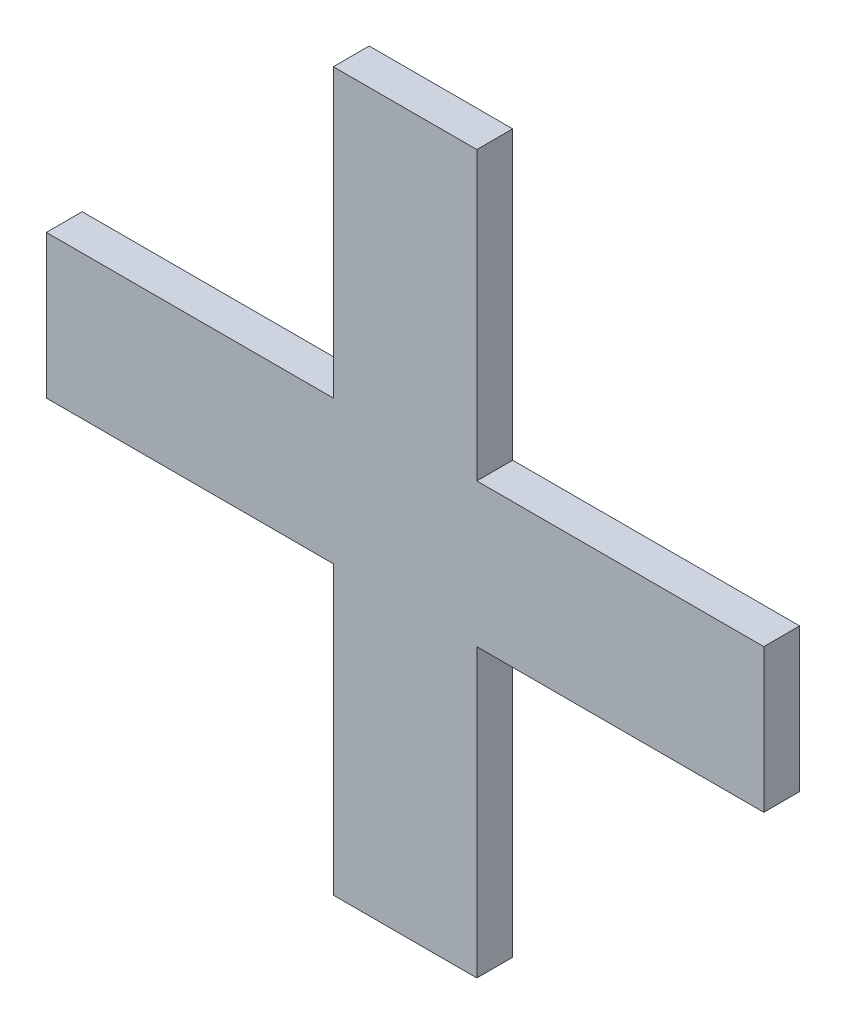
ISO-10303-21;
HEADER;
FILE_DESCRIPTION(('STEP AP214'),'2;1');
FILE_NAME('part.step','',(''),(''),'','','');
FILE_SCHEMA(('AUTOMOTIVE_DESIGN { 1 0 10303 214 1 1 1 1 }'));
ENDSEC;
DATA;
#1=APPLICATION_CONTEXT('core data for automotive mechanical design processes');
#2=APPLICATION_PROTOCOL_DEFINITION('international standard','automotive_design',2000,#1);
#3=PRODUCT_CONTEXT('',#1,'mechanical');
#4=PRODUCT('Part','Part','',(#3));
#5=PRODUCT_RELATED_PRODUCT_CATEGORY('part','',(#4));
#6=PRODUCT_DEFINITION_FORMATION('','',#4);
#7=PRODUCT_DEFINITION_CONTEXT('part definition',#1,'design');
#8=PRODUCT_DEFINITION('design','',#6,#7);
#9=PRODUCT_DEFINITION_SHAPE('','',#8);
#10=(LENGTH_UNIT() NAMED_UNIT(*) SI_UNIT(.MILLI.,.METRE.));
#11=(NAMED_UNIT(*) PLANE_ANGLE_UNIT() SI_UNIT($,.RADIAN.));
#12=(NAMED_UNIT(*) SI_UNIT($,.STERADIAN.) SOLID_ANGLE_UNIT());
#13=UNCERTAINTY_MEASURE_WITH_UNIT(LENGTH_MEASURE(1.E-05),#10,'distance_accuracy_value','');
#14=(GEOMETRIC_REPRESENTATION_CONTEXT(3) GLOBAL_UNCERTAINTY_ASSIGNED_CONTEXT((#13)) GLOBAL_UNIT_ASSIGNED_CONTEXT((#10,
#11,#12)) REPRESENTATION_CONTEXT('',''));
#15=CARTESIAN_POINT('',(0.,0.,0.));
#16=DIRECTION('',(0.,0.,1.));
#17=DIRECTION('',(1.,0.,0.));
#18=AXIS2_PLACEMENT_3D('',#15,#16,#17);
#19=CARTESIAN_POINT('',(-6.35,8.17803030303031,3.175));
#20=DIRECTION('',(1.,0.,0.));
#21=DIRECTION('',(0.,1.,0.));
#22=AXIS2_PLACEMENT_3D('',#19,#20,#21);
#23=PLANE('',#22);
#24=DIRECTION('',(0.,-1.,0.));
#25=VECTOR('',#24,1.);
#26=CARTESIAN_POINT('',(-6.35,8.17803030303031,0.));
#27=LINE('',#26,#25);
#28=CARTESIAN_POINT('',(-6.35,33.5780303030303,0.));
#29=VERTEX_POINT('',#28);
#30=CARTESIAN_POINT('',(-6.35,8.17803030303031,0.));
#31=VERTEX_POINT('',#30);
#32=EDGE_CURVE('E153',#29,#31,#27,.T.);
#33=ORIENTED_EDGE('',*,*,#32,.T.);
#34=DIRECTION('',(0.,0.,-1.));
#35=VECTOR('',#34,1.);
#36=CARTESIAN_POINT('',(-6.35,8.17803030303031,3.175));
#37=LINE('',#36,#35);
#38=CARTESIAN_POINT('',(-6.35,8.17803030303031,3.175));
#39=VERTEX_POINT('',#38);
#40=EDGE_CURVE('E11',#39,#31,#37,.T.);
#41=ORIENTED_EDGE('',*,*,#40,.F.);
#42=DIRECTION('',(0.,-1.,0.));
#43=VECTOR('',#42,1.);
#44=CARTESIAN_POINT('',(-6.35,8.17803030303031,3.175));
#45=LINE('',#44,#43);
#46=CARTESIAN_POINT('',(-6.35,33.5780303030303,3.175));
#47=VERTEX_POINT('',#46);
#48=EDGE_CURVE('E175',#47,#39,#45,.T.);
#49=ORIENTED_EDGE('',*,*,#48,.F.);
#50=DIRECTION('',(0.,0.,-1.));
#51=VECTOR('',#50,1.);
#52=CARTESIAN_POINT('',(-6.35,33.5780303030303,3.175));
#53=LINE('',#52,#51);
#54=EDGE_CURVE('E149',#47,#29,#53,.T.);
#55=ORIENTED_EDGE('',*,*,#54,.T.);
#56=EDGE_LOOP('',(#33,#41,#49,#55));
#57=FACE_BOUND('',#56,.T.);
#58=ADVANCED_FACE('F33',(#57),#23,.F.);
#59=CARTESIAN_POINT('',(-31.75,8.17803030303031,3.175));
#60=DIRECTION('',(0.,-1.,0.));
#61=DIRECTION('',(1.,0.,0.));
#62=AXIS2_PLACEMENT_3D('',#59,#60,#61);
#63=PLANE('',#62);
#64=DIRECTION('',(-1.,0.,0.));
#65=VECTOR('',#64,1.);
#66=CARTESIAN_POINT('',(-31.75,8.17803030303031,0.));
#67=LINE('',#66,#65);
#68=CARTESIAN_POINT('',(-31.75,8.17803030303031,0.));
#69=VERTEX_POINT('',#68);
#70=EDGE_CURVE('E156',#31,#69,#67,.T.);
#71=ORIENTED_EDGE('',*,*,#70,.T.);
#72=DIRECTION('',(0.,0.,-1.));
#73=VECTOR('',#72,1.);
#74=CARTESIAN_POINT('',(-31.75,8.17803030303031,3.175));
#75=LINE('',#74,#73);
#76=CARTESIAN_POINT('',(-31.75,8.17803030303031,3.175));
#77=VERTEX_POINT('',#76);
#78=EDGE_CURVE('E41',#77,#69,#75,.T.);
#79=ORIENTED_EDGE('',*,*,#78,.F.);
#80=DIRECTION('',(-1.,0.,0.));
#81=VECTOR('',#80,1.);
#82=CARTESIAN_POINT('',(-31.75,8.17803030303031,3.175));
#83=LINE('',#82,#81);
#84=EDGE_CURVE('E104',#39,#77,#83,.T.);
#85=ORIENTED_EDGE('',*,*,#84,.F.);
#86=ORIENTED_EDGE('',*,*,#40,.T.);
#87=EDGE_LOOP('',(#71,#79,#85,#86));
#88=FACE_BOUND('',#87,.T.);
#89=ADVANCED_FACE('F253',(#88),#63,.F.);
#90=CARTESIAN_POINT('',(-31.75,-4.52196969696969,3.175));
#91=DIRECTION('',(1.,0.,0.));
#92=DIRECTION('',(0.,0.,-1.));
#93=AXIS2_PLACEMENT_3D('',#90,#91,#92);
#94=PLANE('',#93);
#95=DIRECTION('',(0.,-1.,0.));
#96=VECTOR('',#95,1.);
#97=CARTESIAN_POINT('',(-31.75,-4.52196969696969,0.));
#98=LINE('',#97,#96);
#99=CARTESIAN_POINT('',(-31.75,-4.52196969696969,0.));
#100=VERTEX_POINT('',#99);
#101=EDGE_CURVE('E158',#69,#100,#98,.T.);
#102=ORIENTED_EDGE('',*,*,#101,.T.);
#103=DIRECTION('',(0.,0.,-1.));
#104=VECTOR('',#103,1.);
#105=CARTESIAN_POINT('',(-31.75,-4.52196969696969,3.175));
#106=LINE('',#105,#104);
#107=CARTESIAN_POINT('',(-31.75,-4.52196969696969,3.175));
#108=VERTEX_POINT('',#107);
#109=EDGE_CURVE('E194',#108,#100,#106,.T.);
#110=ORIENTED_EDGE('',*,*,#109,.F.);
#111=DIRECTION('',(0.,-1.,0.));
#112=VECTOR('',#111,1.);
#113=CARTESIAN_POINT('',(-31.75,-4.52196969696969,3.175));
#114=LINE('',#113,#112);
#115=EDGE_CURVE('E202',#77,#108,#114,.T.);
#116=ORIENTED_EDGE('',*,*,#115,.F.);
#117=ORIENTED_EDGE('',*,*,#78,.T.);
#118=EDGE_LOOP('',(#102,#110,#116,#117));
#119=FACE_BOUND('',#118,.T.);
#120=ADVANCED_FACE('F200',(#119),#94,.F.);
#121=CARTESIAN_POINT('',(-6.35,-4.52196969696969,3.175));
#122=DIRECTION('',(0.,1.,0.));
#123=DIRECTION('',(-1.,0.,0.));
#124=AXIS2_PLACEMENT_3D('',#121,#122,#123);
#125=PLANE('',#124);
#126=DIRECTION('',(1.,0.,0.));
#127=VECTOR('',#126,1.);
#128=CARTESIAN_POINT('',(-6.35,-4.52196969696969,0.));
#129=LINE('',#128,#127);
#130=CARTESIAN_POINT('',(-6.35,-4.52196969696969,0.));
#131=VERTEX_POINT('',#130);
#132=EDGE_CURVE('E160',#100,#131,#129,.T.);
#133=ORIENTED_EDGE('',*,*,#132,.T.);
#134=DIRECTION('',(0.,0.,-1.));
#135=VECTOR('',#134,1.);
#136=CARTESIAN_POINT('',(-6.35,-4.52196969696969,3.175));
#137=LINE('',#136,#135);
#138=CARTESIAN_POINT('',(-6.35,-4.52196969696969,3.175));
#139=VERTEX_POINT('',#138);
#140=EDGE_CURVE('E191',#139,#131,#137,.T.);
#141=ORIENTED_EDGE('',*,*,#140,.F.);
#142=DIRECTION('',(1.,0.,0.));
#143=VECTOR('',#142,1.);
#144=CARTESIAN_POINT('',(-6.35,-4.52196969696969,3.175));
#145=LINE('',#144,#143);
#146=EDGE_CURVE('E220',#108,#139,#145,.T.);
#147=ORIENTED_EDGE('',*,*,#146,.F.);
#148=ORIENTED_EDGE('',*,*,#109,.T.);
#149=EDGE_LOOP('',(#133,#141,#147,#148));
#150=FACE_BOUND('',#149,.T.);
#151=ADVANCED_FACE('F211',(#150),#125,.F.);
#152=CARTESIAN_POINT('',(-6.35,-29.9219696969697,3.175));
#153=DIRECTION('',(1.,0.,0.));
#154=DIRECTION('',(0.,1.,0.));
#155=AXIS2_PLACEMENT_3D('',#152,#153,#154);
#156=PLANE('',#155);
#157=DIRECTION('',(0.,-1.,0.));
#158=VECTOR('',#157,1.);
#159=CARTESIAN_POINT('',(-6.35,-29.9219696969697,0.));
#160=LINE('',#159,#158);
#161=CARTESIAN_POINT('',(-6.35,-29.9219696969697,0.));
#162=VERTEX_POINT('',#161);
#163=EDGE_CURVE('E162',#131,#162,#160,.T.);
#164=ORIENTED_EDGE('',*,*,#163,.T.);
#165=DIRECTION('',(0.,0.,-1.));
#166=VECTOR('',#165,1.);
#167=CARTESIAN_POINT('',(-6.35,-29.9219696969697,3.175));
#168=LINE('',#167,#166);
#169=CARTESIAN_POINT('',(-6.35,-29.9219696969697,3.175));
#170=VERTEX_POINT('',#169);
#171=EDGE_CURVE('E188',#170,#162,#168,.T.);
#172=ORIENTED_EDGE('',*,*,#171,.F.);
#173=DIRECTION('',(0.,-1.,0.));
#174=VECTOR('',#173,1.);
#175=CARTESIAN_POINT('',(-6.35,-29.9219696969697,3.175));
#176=LINE('',#175,#174);
#177=EDGE_CURVE('E217',#139,#170,#176,.T.);
#178=ORIENTED_EDGE('',*,*,#177,.F.);
#179=ORIENTED_EDGE('',*,*,#140,.T.);
#180=EDGE_LOOP('',(#164,#172,#178,#179));
#181=FACE_BOUND('',#180,.T.);
#182=ADVANCED_FACE('F215',(#181),#156,.F.);
#183=CARTESIAN_POINT('',(6.35,-29.9219696969697,3.175));
#184=DIRECTION('',(0.,1.,0.));
#185=DIRECTION('',(0.,0.,1.));
#186=AXIS2_PLACEMENT_3D('',#183,#184,#185);
#187=PLANE('',#186);
#188=DIRECTION('',(1.,0.,0.));
#189=VECTOR('',#188,1.);
#190=CARTESIAN_POINT('',(6.35,-29.9219696969697,0.));
#191=LINE('',#190,#189);
#192=CARTESIAN_POINT('',(6.35,-29.9219696969697,0.));
#193=VERTEX_POINT('',#192);
#194=EDGE_CURVE('E164',#162,#193,#191,.T.);
#195=ORIENTED_EDGE('',*,*,#194,.T.);
#196=DIRECTION('',(0.,0.,-1.));
#197=VECTOR('',#196,1.);
#198=CARTESIAN_POINT('',(6.35,-29.9219696969697,3.175));
#199=LINE('',#198,#197);
#200=CARTESIAN_POINT('',(6.35,-29.9219696969697,3.175));
#201=VERTEX_POINT('',#200);
#202=EDGE_CURVE('E185',#201,#193,#199,.T.);
#203=ORIENTED_EDGE('',*,*,#202,.F.);
#204=DIRECTION('',(1.,0.,0.));
#205=VECTOR('',#204,1.);
#206=CARTESIAN_POINT('',(6.35,-29.9219696969697,3.175));
#207=LINE('',#206,#205);
#208=EDGE_CURVE('E219',#170,#201,#207,.T.);
#209=ORIENTED_EDGE('',*,*,#208,.F.);
#210=ORIENTED_EDGE('',*,*,#171,.T.);
#211=EDGE_LOOP('',(#195,#203,#209,#210));
#212=FACE_BOUND('',#211,.T.);
#213=ADVANCED_FACE('F266',(#212),#187,.F.);
#214=CARTESIAN_POINT('',(6.35,-4.5219696969697,3.175));
#215=DIRECTION('',(-1.,0.,0.));
#216=DIRECTION('',(0.,-1.,0.));
#217=AXIS2_PLACEMENT_3D('',#214,#215,#216);
#218=PLANE('',#217);
#219=DIRECTION('',(0.,1.,0.));
#220=VECTOR('',#219,1.);
#221=CARTESIAN_POINT('',(6.35,-4.5219696969697,0.));
#222=LINE('',#221,#220);
#223=CARTESIAN_POINT('',(6.35,-4.5219696969697,0.));
#224=VERTEX_POINT('',#223);
#225=EDGE_CURVE('E166',#193,#224,#222,.T.);
#226=ORIENTED_EDGE('',*,*,#225,.T.);
#227=DIRECTION('',(0.,0.,-1.));
#228=VECTOR('',#227,1.);
#229=CARTESIAN_POINT('',(6.35,-4.5219696969697,3.175));
#230=LINE('',#229,#228);
#231=CARTESIAN_POINT('',(6.35,-4.5219696969697,3.175));
#232=VERTEX_POINT('',#231);
#233=EDGE_CURVE('E182',#232,#224,#230,.T.);
#234=ORIENTED_EDGE('',*,*,#233,.F.);
#235=DIRECTION('',(0.,1.,0.));
#236=VECTOR('',#235,1.);
#237=CARTESIAN_POINT('',(6.35,-4.5219696969697,3.175));
#238=LINE('',#237,#236);
#239=EDGE_CURVE('E222',#201,#232,#238,.T.);
#240=ORIENTED_EDGE('',*,*,#239,.F.);
#241=ORIENTED_EDGE('',*,*,#202,.T.);
#242=EDGE_LOOP('',(#226,#234,#240,#241));
#243=FACE_BOUND('',#242,.T.);
#244=ADVANCED_FACE('F269',(#243),#218,.F.);
#245=CARTESIAN_POINT('',(31.75,-4.52196969696969,3.175));
#246=DIRECTION('',(0.,1.,0.));
#247=DIRECTION('',(-1.,0.,0.));
#248=AXIS2_PLACEMENT_3D('',#245,#246,#247);
#249=PLANE('',#248);
#250=DIRECTION('',(1.,0.,0.));
#251=VECTOR('',#250,1.);
#252=CARTESIAN_POINT('',(31.75,-4.52196969696969,0.));
#253=LINE('',#252,#251);
#254=CARTESIAN_POINT('',(31.75,-4.52196969696969,0.));
#255=VERTEX_POINT('',#254);
#256=EDGE_CURVE('E168',#224,#255,#253,.T.);
#257=ORIENTED_EDGE('',*,*,#256,.T.);
#258=DIRECTION('',(0.,0.,-1.));
#259=VECTOR('',#258,1.);
#260=CARTESIAN_POINT('',(31.75,-4.52196969696969,3.175));
#261=LINE('',#260,#259);
#262=CARTESIAN_POINT('',(31.75,-4.52196969696969,3.175));
#263=VERTEX_POINT('',#262);
#264=EDGE_CURVE('E179',#263,#255,#261,.T.);
#265=ORIENTED_EDGE('',*,*,#264,.F.);
#266=DIRECTION('',(1.,0.,0.));
#267=VECTOR('',#266,1.);
#268=CARTESIAN_POINT('',(31.75,-4.52196969696969,3.175));
#269=LINE('',#268,#267);
#270=EDGE_CURVE('E228',#232,#263,#269,.T.);
#271=ORIENTED_EDGE('',*,*,#270,.F.);
#272=ORIENTED_EDGE('',*,*,#233,.T.);
#273=EDGE_LOOP('',(#257,#265,#271,#272));
#274=FACE_BOUND('',#273,.T.);
#275=ADVANCED_FACE('F234',(#274),#249,.F.);
#276=CARTESIAN_POINT('',(31.75,8.17803030303031,3.175));
#277=DIRECTION('',(-1.,0.,0.));
#278=DIRECTION('',(0.,0.,1.));
#279=AXIS2_PLACEMENT_3D('',#276,#277,#278);
#280=PLANE('',#279);
#281=DIRECTION('',(0.,1.,0.));
#282=VECTOR('',#281,1.);
#283=CARTESIAN_POINT('',(31.75,8.17803030303031,0.));
#284=LINE('',#283,#282);
#285=CARTESIAN_POINT('',(31.75,8.17803030303031,0.));
#286=VERTEX_POINT('',#285);
#287=EDGE_CURVE('E170',#255,#286,#284,.T.);
#288=ORIENTED_EDGE('',*,*,#287,.T.);
#289=DIRECTION('',(0.,0.,-1.));
#290=VECTOR('',#289,1.);
#291=CARTESIAN_POINT('',(31.75,8.17803030303031,3.175));
#292=LINE('',#291,#290);
#293=CARTESIAN_POINT('',(31.75,8.17803030303031,3.175));
#294=VERTEX_POINT('',#293);
#295=EDGE_CURVE('E144',#294,#286,#292,.T.);
#296=ORIENTED_EDGE('',*,*,#295,.F.);
#297=DIRECTION('',(0.,1.,0.));
#298=VECTOR('',#297,1.);
#299=CARTESIAN_POINT('',(31.75,8.17803030303031,3.175));
#300=LINE('',#299,#298);
#301=EDGE_CURVE('E135',#263,#294,#300,.T.);
#302=ORIENTED_EDGE('',*,*,#301,.F.);
#303=ORIENTED_EDGE('',*,*,#264,.T.);
#304=EDGE_LOOP('',(#288,#296,#302,#303));
#305=FACE_BOUND('',#304,.T.);
#306=ADVANCED_FACE('F238',(#305),#280,.F.);
#307=CARTESIAN_POINT('',(6.35,8.17803030303031,3.175));
#308=DIRECTION('',(0.,-1.,0.));
#309=DIRECTION('',(0.,0.,-1.));
#310=AXIS2_PLACEMENT_3D('',#307,#308,#309);
#311=PLANE('',#310);
#312=DIRECTION('',(-1.,0.,0.));
#313=VECTOR('',#312,1.);
#314=CARTESIAN_POINT('',(6.35,8.17803030303031,0.));
#315=LINE('',#314,#313);
#316=CARTESIAN_POINT('',(6.35,8.17803030303031,0.));
#317=VERTEX_POINT('',#316);
#318=EDGE_CURVE('E143',#286,#317,#315,.T.);
#319=ORIENTED_EDGE('',*,*,#318,.T.);
#320=DIRECTION('',(0.,0.,-1.));
#321=VECTOR('',#320,1.);
#322=CARTESIAN_POINT('',(6.35,8.17803030303031,3.175));
#323=LINE('',#322,#321);
#324=CARTESIAN_POINT('',(6.35,8.17803030303031,3.175));
#325=VERTEX_POINT('',#324);
#326=EDGE_CURVE('E140',#325,#317,#323,.T.);
#327=ORIENTED_EDGE('',*,*,#326,.F.);
#328=DIRECTION('',(-1.,0.,0.));
#329=VECTOR('',#328,1.);
#330=CARTESIAN_POINT('',(6.35,8.17803030303031,3.175));
#331=LINE('',#330,#329);
#332=EDGE_CURVE('E129',#294,#325,#331,.T.);
#333=ORIENTED_EDGE('',*,*,#332,.F.);
#334=ORIENTED_EDGE('',*,*,#295,.T.);
#335=EDGE_LOOP('',(#319,#327,#333,#334));
#336=FACE_BOUND('',#335,.T.);
#337=ADVANCED_FACE('F141',(#336),#311,.F.);
#338=CARTESIAN_POINT('',(6.35,33.5780303030303,3.175));
#339=DIRECTION('',(-1.,0.,0.));
#340=DIRECTION('',(0.,-1.,0.));
#341=AXIS2_PLACEMENT_3D('',#338,#339,#340);
#342=PLANE('',#341);
#343=DIRECTION('',(0.,1.,0.));
#344=VECTOR('',#343,1.);
#345=CARTESIAN_POINT('',(6.35,33.5780303030303,0.));
#346=LINE('',#345,#344);
#347=CARTESIAN_POINT('',(6.35,33.5780303030303,0.));
#348=VERTEX_POINT('',#347);
#349=EDGE_CURVE('E90',#317,#348,#346,.T.);
#350=ORIENTED_EDGE('',*,*,#349,.T.);
#351=DIRECTION('',(0.,0.,-1.));
#352=VECTOR('',#351,1.);
#353=CARTESIAN_POINT('',(6.35,33.5780303030303,3.175));
#354=LINE('',#353,#352);
#355=CARTESIAN_POINT('',(6.35,33.5780303030303,3.175));
#356=VERTEX_POINT('',#355);
#357=EDGE_CURVE('E145',#356,#348,#354,.T.);
#358=ORIENTED_EDGE('',*,*,#357,.F.);
#359=DIRECTION('',(0.,1.,0.));
#360=VECTOR('',#359,1.);
#361=CARTESIAN_POINT('',(6.35,33.5780303030303,3.175));
#362=LINE('',#361,#360);
#363=EDGE_CURVE('E133',#325,#356,#362,.T.);
#364=ORIENTED_EDGE('',*,*,#363,.F.);
#365=ORIENTED_EDGE('',*,*,#326,.T.);
#366=EDGE_LOOP('',(#350,#358,#364,#365));
#367=FACE_BOUND('',#366,.T.);
#368=ADVANCED_FACE('F147',(#367),#342,.F.);
#369=CARTESIAN_POINT('',(-6.35,33.5780303030303,3.175));
#370=DIRECTION('',(0.,-1.,0.));
#371=DIRECTION('',(0.,0.,-1.));
#372=AXIS2_PLACEMENT_3D('',#369,#370,#371);
#373=PLANE('',#372);
#374=DIRECTION('',(-1.,0.,0.));
#375=VECTOR('',#374,1.);
#376=CARTESIAN_POINT('',(-6.35,33.5780303030303,0.));
#377=LINE('',#376,#375);
#378=EDGE_CURVE('E96',#348,#29,#377,.T.);
#379=ORIENTED_EDGE('',*,*,#378,.T.);
#380=ORIENTED_EDGE('',*,*,#54,.F.);
#381=DIRECTION('',(-1.,0.,0.));
#382=VECTOR('',#381,1.);
#383=CARTESIAN_POINT('',(-6.35,33.5780303030303,3.175));
#384=LINE('',#383,#382);
#385=EDGE_CURVE('E49',#356,#47,#384,.T.);
#386=ORIENTED_EDGE('',*,*,#385,.F.);
#387=ORIENTED_EDGE('',*,*,#357,.T.);
#388=EDGE_LOOP('',(#379,#380,#386,#387));
#389=FACE_BOUND('',#388,.T.);
#390=ADVANCED_FACE('F242',(#389),#373,.F.);
#391=CARTESIAN_POINT('',(0.,0.,3.175));
#392=DIRECTION('',(0.,0.,-1.));
#393=DIRECTION('',(-1.,0.,0.));
#394=AXIS2_PLACEMENT_3D('',#391,#392,#393);
#395=PLANE('',#394);
#396=ORIENTED_EDGE('',*,*,#48,.T.);
#397=ORIENTED_EDGE('',*,*,#84,.T.);
#398=ORIENTED_EDGE('',*,*,#115,.T.);
#399=ORIENTED_EDGE('',*,*,#146,.T.);
#400=ORIENTED_EDGE('',*,*,#177,.T.);
#401=ORIENTED_EDGE('',*,*,#208,.T.);
#402=ORIENTED_EDGE('',*,*,#239,.T.);
#403=ORIENTED_EDGE('',*,*,#270,.T.);
#404=ORIENTED_EDGE('',*,*,#301,.T.);
#405=ORIENTED_EDGE('',*,*,#332,.T.);
#406=ORIENTED_EDGE('',*,*,#363,.T.);
#407=ORIENTED_EDGE('',*,*,#385,.T.);
#408=EDGE_LOOP('',(#396,#397,#398,#399,#400,#401,#402,#403,#404,#405,#406,#407));
#409=FACE_BOUND('',#408,.T.);
#410=ADVANCED_FACE('F131',(#409),#395,.F.);
#411=CARTESIAN_POINT('',(0.,0.,0.));
#412=DIRECTION('',(0.,0.,-1.));
#413=DIRECTION('',(-1.,0.,0.));
#414=AXIS2_PLACEMENT_3D('',#411,#412,#413);
#415=PLANE('',#414);
#416=ORIENTED_EDGE('',*,*,#32,.F.);
#417=ORIENTED_EDGE('',*,*,#378,.F.);
#418=ORIENTED_EDGE('',*,*,#349,.F.);
#419=ORIENTED_EDGE('',*,*,#318,.F.);
#420=ORIENTED_EDGE('',*,*,#287,.F.);
#421=ORIENTED_EDGE('',*,*,#256,.F.);
#422=ORIENTED_EDGE('',*,*,#225,.F.);
#423=ORIENTED_EDGE('',*,*,#194,.F.);
#424=ORIENTED_EDGE('',*,*,#163,.F.);
#425=ORIENTED_EDGE('',*,*,#132,.F.);
#426=ORIENTED_EDGE('',*,*,#101,.F.);
#427=ORIENTED_EDGE('',*,*,#70,.F.);
#428=EDGE_LOOP('',(#416,#417,#418,#419,#420,#421,#422,#423,#424,#425,#426,#427));
#429=FACE_BOUND('',#428,.T.);
#430=ADVANCED_FACE('F206',(#429),#415,.T.);
#431=CLOSED_SHELL('',(#58,#89,#120,#151,#182,#213,#244,#275,#306,#337,#368,#390,#410,#430));
#432=MANIFOLD_SOLID_BREP('B2',#431);
#433=ADVANCED_BREP_SHAPE_REPRESENTATION('',(#18,#432),#14);
#434=SHAPE_DEFINITION_REPRESENTATION(#9,#433);
ENDSEC;
END-ISO-10303-21;
